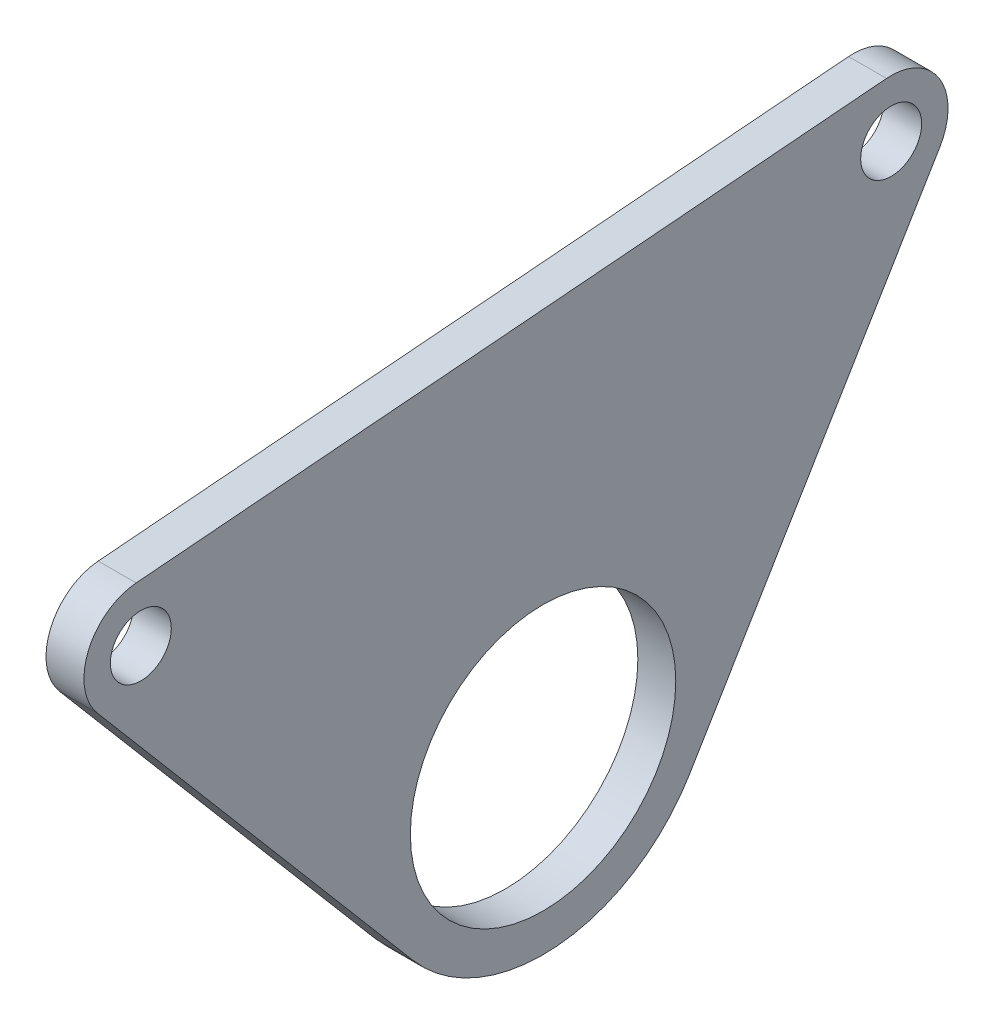
ISO-10303-21;
HEADER;
FILE_DESCRIPTION(('STEP AP214'),'2;1');
FILE_NAME('part.step','',(''),(''),'','','');
FILE_SCHEMA(('AUTOMOTIVE_DESIGN { 1 0 10303 214 1 1 1 1 }'));
ENDSEC;
DATA;
#1=APPLICATION_CONTEXT('core data for automotive mechanical design processes');
#2=APPLICATION_PROTOCOL_DEFINITION('international standard','automotive_design',2000,#1);
#3=PRODUCT_CONTEXT('',#1,'mechanical');
#4=PRODUCT('Part','Part','',(#3));
#5=PRODUCT_RELATED_PRODUCT_CATEGORY('part','',(#4));
#6=PRODUCT_DEFINITION_FORMATION('','',#4);
#7=PRODUCT_DEFINITION_CONTEXT('part definition',#1,'design');
#8=PRODUCT_DEFINITION('design','',#6,#7);
#9=PRODUCT_DEFINITION_SHAPE('','',#8);
#10=(LENGTH_UNIT() NAMED_UNIT(*) SI_UNIT(.MILLI.,.METRE.));
#11=(NAMED_UNIT(*) PLANE_ANGLE_UNIT() SI_UNIT($,.RADIAN.));
#12=(NAMED_UNIT(*) SI_UNIT($,.STERADIAN.) SOLID_ANGLE_UNIT());
#13=UNCERTAINTY_MEASURE_WITH_UNIT(LENGTH_MEASURE(1.E-05),#10,'distance_accuracy_value','');
#14=(GEOMETRIC_REPRESENTATION_CONTEXT(3) GLOBAL_UNCERTAINTY_ASSIGNED_CONTEXT((#13)) GLOBAL_UNIT_ASSIGNED_CONTEXT((#10,
#11,#12)) REPRESENTATION_CONTEXT('',''));
#15=CARTESIAN_POINT('',(0.,0.,0.));
#16=DIRECTION('',(0.,0.,1.));
#17=DIRECTION('',(1.,0.,0.));
#18=AXIS2_PLACEMENT_3D('',#15,#16,#17);
#19=CARTESIAN_POINT('',(-301.625,96.9630533956429,495.757540874985));
#20=DIRECTION('',(-1.,0.,0.));
#21=DIRECTION('',(0.,-1.,0.));
#22=AXIS2_PLACEMENT_3D('',#19,#20,#21);
#23=CYLINDRICAL_SURFACE('',#22,14.2875);
#24=CARTESIAN_POINT('',(-304.8,96.9630533956429,495.757540874985));
#25=DIRECTION('',(1.,0.,0.));
#26=DIRECTION('',(0.,1.,0.));
#27=AXIS2_PLACEMENT_3D('',#24,#25,#26);
#28=CIRCLE('',#27,14.2875);
#29=CARTESIAN_POINT('',(-304.8,87.7184354309227,506.651102961666));
#30=VERTEX_POINT('',#29);
#31=CARTESIAN_POINT('',(-304.8,89.6237613560438,483.499178479972));
#32=VERTEX_POINT('',#31);
#33=EDGE_CURVE('E122',#30,#32,#28,.T.);
#34=ORIENTED_EDGE('',*,*,#33,.T.);
#35=DIRECTION('',(-1.,0.,0.));
#36=VECTOR('',#35,1.);
#37=CARTESIAN_POINT('',(-301.625,89.6237613560438,483.499178479972));
#38=LINE('',#37,#36);
#39=CARTESIAN_POINT('',(-301.625,89.6237613560438,483.499178479972));
#40=VERTEX_POINT('',#39);
#41=EDGE_CURVE('E11',#40,#32,#38,.T.);
#42=ORIENTED_EDGE('',*,*,#41,.F.);
#43=CARTESIAN_POINT('',(-301.625,96.9630533956429,495.757540874985));
#44=DIRECTION('',(1.,0.,0.));
#45=DIRECTION('',(0.,1.,0.));
#46=AXIS2_PLACEMENT_3D('',#43,#44,#45);
#47=CIRCLE('',#46,14.2875);
#48=CARTESIAN_POINT('',(-301.625,87.7184354309227,506.651102961666));
#49=VERTEX_POINT('',#48);
#50=EDGE_CURVE('E69',#49,#40,#47,.T.);
#51=ORIENTED_EDGE('',*,*,#50,.F.);
#52=DIRECTION('',(-1.,0.,0.));
#53=VECTOR('',#52,1.);
#54=CARTESIAN_POINT('',(-301.625,87.7184354309227,506.651102961666));
#55=LINE('',#54,#53);
#56=EDGE_CURVE('E101',#49,#30,#55,.T.);
#57=ORIENTED_EDGE('',*,*,#56,.T.);
#58=EDGE_LOOP('',(#34,#42,#51,#57));
#59=FACE_BOUND('',#58,.T.);
#60=ADVANCED_FACE('F17',(#59),#23,.T.);
#61=CARTESIAN_POINT('',(-301.625,107.140398876517,473.011666839163));
#62=DIRECTION('',(0.,-0.51368623199418,-0.857978120385142));
#63=DIRECTION('',(0.,0.857978120385142,-0.51368623199418));
#64=AXIS2_PLACEMENT_3D('',#61,#62,#63);
#65=PLANE('',#64);
#66=DIRECTION('',(0.,-0.857978120385142,0.513686231994179));
#67=VECTOR('',#66,1.);
#68=CARTESIAN_POINT('',(-304.8,107.140398876517,473.011666839163));
#69=LINE('',#68,#67);
#70=CARTESIAN_POINT('',(-304.8,124.65703639699,462.524155198353));
#71=VERTEX_POINT('',#70);
#72=EDGE_CURVE('E141',#71,#32,#69,.T.);
#73=ORIENTED_EDGE('',*,*,#72,.F.);
#74=DIRECTION('',(-1.,0.,0.));
#75=VECTOR('',#74,1.);
#76=CARTESIAN_POINT('',(-301.625,124.65703639699,462.524155198353));
#77=LINE('',#76,#75);
#78=CARTESIAN_POINT('',(-301.625,124.65703639699,462.524155198353));
#79=VERTEX_POINT('',#78);
#80=EDGE_CURVE('E27',#79,#71,#77,.T.);
#81=ORIENTED_EDGE('',*,*,#80,.F.);
#82=DIRECTION('',(0.,-0.857978120385142,0.513686231994179));
#83=VECTOR('',#82,1.);
#84=CARTESIAN_POINT('',(-301.625,107.140398876517,473.011666839163));
#85=LINE('',#84,#83);
#86=EDGE_CURVE('E105',#79,#40,#85,.T.);
#87=ORIENTED_EDGE('',*,*,#86,.T.);
#88=ORIENTED_EDGE('',*,*,#41,.T.);
#89=EDGE_LOOP('',(#73,#81,#87,#88));
#90=FACE_BOUND('',#89,.T.);
#91=ADVANCED_FACE('F161',(#90),#65,.T.);
#92=CARTESIAN_POINT('',(-301.625,127.103467076862,466.610275996687));
#93=DIRECTION('',(-1.,0.,0.));
#94=DIRECTION('',(0.,-1.,0.));
#95=AXIS2_PLACEMENT_3D('',#92,#93,#94);
#96=CYLINDRICAL_SURFACE('',#95,4.7625);
#97=CARTESIAN_POINT('',(-304.8,127.103467076862,466.610275996687));
#98=DIRECTION('',(1.,0.,0.));
#99=DIRECTION('',(0.,1.,0.));
#100=AXIS2_PLACEMENT_3D('',#97,#98,#99);
#101=CIRCLE('',#100,4.7625);
#102=CARTESIAN_POINT('',(-304.8,131.849920952703,467.000893270388));
#103=VERTEX_POINT('',#102);
#104=EDGE_CURVE('E136',#71,#103,#101,.T.);
#105=ORIENTED_EDGE('',*,*,#104,.T.);
#106=DIRECTION('',(-1.,0.,0.));
#107=VECTOR('',#106,1.);
#108=CARTESIAN_POINT('',(-301.625,131.849920952703,467.000893270388));
#109=LINE('',#108,#107);
#110=CARTESIAN_POINT('',(-301.625,131.849920952703,467.000893270388));
#111=VERTEX_POINT('',#110);
#112=EDGE_CURVE('E57',#111,#103,#109,.T.);
#113=ORIENTED_EDGE('',*,*,#112,.F.);
#114=CARTESIAN_POINT('',(-301.625,127.103467076862,466.610275996687));
#115=DIRECTION('',(1.,0.,0.));
#116=DIRECTION('',(0.,1.,0.));
#117=AXIS2_PLACEMENT_3D('',#114,#115,#116);
#118=CIRCLE('',#117,4.7625);
#119=EDGE_CURVE('E106',#79,#111,#118,.T.);
#120=ORIENTED_EDGE('',*,*,#119,.F.);
#121=ORIENTED_EDGE('',*,*,#80,.T.);
#122=EDGE_LOOP('',(#105,#113,#120,#121));
#123=FACE_BOUND('',#122,.T.);
#124=ADVANCED_FACE('F162',(#123),#96,.T.);
#125=CARTESIAN_POINT('',(-301.625,129.264575279459,498.415848054336));
#126=DIRECTION('',(0.,0.996630735084726,0.0820193750554039));
#127=DIRECTION('',(0.,-0.0820193750554039,0.996630735084726));
#128=AXIS2_PLACEMENT_3D('',#125,#126,#127);
#129=PLANE('',#128);
#130=DIRECTION('',(0.,0.0820193750554039,-0.996630735084726));
#131=VECTOR('',#130,1.);
#132=CARTESIAN_POINT('',(-304.8,129.264575279459,498.415848054336));
#133=LINE('',#132,#131);
#134=CARTESIAN_POINT('',(-304.8,126.679229606215,529.830802838285));
#135=VERTEX_POINT('',#134);
#136=EDGE_CURVE('E145',#135,#103,#133,.T.);
#137=ORIENTED_EDGE('',*,*,#136,.F.);
#138=DIRECTION('',(-1.,0.,0.));
#139=VECTOR('',#138,1.);
#140=CARTESIAN_POINT('',(-301.625,126.679229606215,529.830802838285));
#141=LINE('',#140,#139);
#142=CARTESIAN_POINT('',(-301.625,126.679229606215,529.830802838285));
#143=VERTEX_POINT('',#142);
#144=EDGE_CURVE('E100',#143,#135,#141,.T.);
#145=ORIENTED_EDGE('',*,*,#144,.F.);
#146=DIRECTION('',(0.,0.0820193750554039,-0.996630735084726));
#147=VECTOR('',#146,1.);
#148=CARTESIAN_POINT('',(-301.625,129.264575279459,498.415848054336));
#149=LINE('',#148,#147);
#150=EDGE_CURVE('E85',#143,#111,#149,.T.);
#151=ORIENTED_EDGE('',*,*,#150,.T.);
#152=ORIENTED_EDGE('',*,*,#112,.T.);
#153=EDGE_LOOP('',(#137,#145,#151,#152));
#154=FACE_BOUND('',#153,.T.);
#155=ADVANCED_FACE('F163',(#154),#129,.T.);
#156=CARTESIAN_POINT('',(-301.625,121.932775730374,529.440185564583));
#157=DIRECTION('',(-1.,0.,0.));
#158=DIRECTION('',(0.,-1.,0.));
#159=AXIS2_PLACEMENT_3D('',#156,#157,#158);
#160=CYLINDRICAL_SURFACE('',#159,4.7625);
#161=CARTESIAN_POINT('',(-304.8,121.932775730374,529.440185564583));
#162=DIRECTION('',(1.,0.,0.));
#163=DIRECTION('',(0.,1.,0.));
#164=AXIS2_PLACEMENT_3D('',#161,#162,#163);
#165=CIRCLE('',#164,4.7625);
#166=CARTESIAN_POINT('',(-304.8,118.851236408799,533.071372926809));
#167=VERTEX_POINT('',#166);
#168=EDGE_CURVE('E95',#135,#167,#165,.T.);
#169=ORIENTED_EDGE('',*,*,#168,.T.);
#170=DIRECTION('',(-1.,0.,0.));
#171=VECTOR('',#170,1.);
#172=CARTESIAN_POINT('',(-301.625,118.851236408799,533.071372926809));
#173=LINE('',#172,#171);
#174=CARTESIAN_POINT('',(-301.625,118.851236408799,533.071372926809));
#175=VERTEX_POINT('',#174);
#176=EDGE_CURVE('E92',#175,#167,#173,.T.);
#177=ORIENTED_EDGE('',*,*,#176,.F.);
#178=CARTESIAN_POINT('',(-301.625,121.932775730374,529.440185564583));
#179=DIRECTION('',(1.,0.,0.));
#180=DIRECTION('',(0.,1.,0.));
#181=AXIS2_PLACEMENT_3D('',#178,#179,#180);
#182=CIRCLE('',#181,4.7625);
#183=EDGE_CURVE('E79',#143,#175,#182,.T.);
#184=ORIENTED_EDGE('',*,*,#183,.F.);
#185=ORIENTED_EDGE('',*,*,#144,.T.);
#186=EDGE_LOOP('',(#169,#177,#184,#185));
#187=FACE_BOUND('',#186,.T.);
#188=ADVANCED_FACE('F93',(#187),#160,.T.);
#189=CARTESIAN_POINT('',(-301.625,121.932775730374,529.440185564583));
#190=DIRECTION('',(-1.,0.,0.));
#191=DIRECTION('',(0.,-1.,0.));
#192=AXIS2_PLACEMENT_3D('',#189,#190,#191);
#193=CYLINDRICAL_SURFACE('',#192,2.5527);
#194=CARTESIAN_POINT('',(-301.625,121.932775730374,529.440185564583));
#195=DIRECTION('',(1.,0.,0.));
#196=DIRECTION('',(0.,1.,0.));
#197=AXIS2_PLACEMENT_3D('',#194,#195,#196);
#198=CIRCLE('',#197,2.5527);
#199=CARTESIAN_POINT('',(-301.625,124.485475730374,529.440185564583));
#200=VERTEX_POINT('',#199);
#201=EDGE_CURVE('E89',#200,#200,#198,.T.);
#202=ORIENTED_EDGE('',*,*,#201,.T.);
#203=EDGE_LOOP('',(#202));
#204=FACE_BOUND('',#203,.T.);
#205=CARTESIAN_POINT('',(-304.8,121.932775730374,529.440185564583));
#206=DIRECTION('',(1.,0.,0.));
#207=DIRECTION('',(0.,1.,0.));
#208=AXIS2_PLACEMENT_3D('',#205,#206,#207);
#209=CIRCLE('',#208,2.5527);
#210=CARTESIAN_POINT('',(-304.8,124.485475730374,529.440185564583));
#211=VERTEX_POINT('',#210);
#212=EDGE_CURVE('E126',#211,#211,#209,.T.);
#213=ORIENTED_EDGE('',*,*,#212,.F.);
#214=EDGE_LOOP('',(#213));
#215=FACE_BOUND('',#214,.T.);
#216=ADVANCED_FACE('F170',(#204,#215),#193,.F.);
#217=CARTESIAN_POINT('',(-301.625,103.284835919867,519.86123794423));
#218=DIRECTION('',(0.,-0.647042377233646,0.762454039312425));
#219=DIRECTION('',(0.,-0.762454039312425,-0.647042377233646));
#220=AXIS2_PLACEMENT_3D('',#217,#218,#219);
#221=PLANE('',#220);
#222=DIRECTION('',(0.,0.762454039312425,0.647042377233646));
#223=VECTOR('',#222,1.);
#224=CARTESIAN_POINT('',(-304.8,103.284835919867,519.86123794423));
#225=LINE('',#224,#223);
#226=EDGE_CURVE('E139',#30,#167,#225,.T.);
#227=ORIENTED_EDGE('',*,*,#226,.F.);
#228=ORIENTED_EDGE('',*,*,#56,.F.);
#229=DIRECTION('',(0.,0.762454039312425,0.647042377233646));
#230=VECTOR('',#229,1.);
#231=CARTESIAN_POINT('',(-301.625,103.284835919867,519.86123794423));
#232=LINE('',#231,#230);
#233=EDGE_CURVE('E84',#49,#175,#232,.T.);
#234=ORIENTED_EDGE('',*,*,#233,.T.);
#235=ORIENTED_EDGE('',*,*,#176,.T.);
#236=EDGE_LOOP('',(#227,#228,#234,#235));
#237=FACE_BOUND('',#236,.T.);
#238=ADVANCED_FACE('F103',(#237),#221,.T.);
#239=CARTESIAN_POINT('',(-301.625,96.963053395661,495.757540874975));
#240=DIRECTION('',(-1.,0.,0.));
#241=DIRECTION('',(0.,-1.,0.));
#242=AXIS2_PLACEMENT_3D('',#239,#240,#241);
#243=CYLINDRICAL_SURFACE('',#242,11.1125);
#244=CARTESIAN_POINT('',(-301.625,96.963053395661,495.757540874975));
#245=DIRECTION('',(1.,0.,0.));
#246=DIRECTION('',(0.,1.,0.));
#247=AXIS2_PLACEMENT_3D('',#244,#245,#246);
#248=CIRCLE('',#247,11.1125);
#249=CARTESIAN_POINT('',(-301.625,108.075553395661,495.757540874975));
#250=VERTEX_POINT('',#249);
#251=EDGE_CURVE('E149',#250,#250,#248,.T.);
#252=ORIENTED_EDGE('',*,*,#251,.T.);
#253=EDGE_LOOP('',(#252));
#254=FACE_BOUND('',#253,.T.);
#255=CARTESIAN_POINT('',(-304.8,96.963053395661,495.757540874975));
#256=DIRECTION('',(1.,0.,0.));
#257=DIRECTION('',(0.,1.,0.));
#258=AXIS2_PLACEMENT_3D('',#255,#256,#257);
#259=CIRCLE('',#258,11.1125);
#260=CARTESIAN_POINT('',(-304.8,108.075553395661,495.757540874975));
#261=VERTEX_POINT('',#260);
#262=EDGE_CURVE('E118',#261,#261,#259,.T.);
#263=ORIENTED_EDGE('',*,*,#262,.F.);
#264=EDGE_LOOP('',(#263));
#265=FACE_BOUND('',#264,.T.);
#266=ADVANCED_FACE('F19',(#254,#265),#243,.F.);
#267=CARTESIAN_POINT('',(-301.625,127.103467076862,466.610275996687));
#268=DIRECTION('',(-1.,0.,0.));
#269=DIRECTION('',(0.,-1.,0.));
#270=AXIS2_PLACEMENT_3D('',#267,#268,#269);
#271=CYLINDRICAL_SURFACE('',#270,2.5527);
#272=CARTESIAN_POINT('',(-301.625,127.103467076862,466.610275996687));
#273=DIRECTION('',(1.,0.,0.));
#274=DIRECTION('',(0.,1.,0.));
#275=AXIS2_PLACEMENT_3D('',#272,#273,#274);
#276=CIRCLE('',#275,2.5527);
#277=CARTESIAN_POINT('',(-301.625,129.656167076862,466.610275996687));
#278=VERTEX_POINT('',#277);
#279=EDGE_CURVE('E88',#278,#278,#276,.T.);
#280=ORIENTED_EDGE('',*,*,#279,.T.);
#281=EDGE_LOOP('',(#280));
#282=FACE_BOUND('',#281,.T.);
#283=CARTESIAN_POINT('',(-304.8,127.103467076862,466.610275996687));
#284=DIRECTION('',(1.,0.,0.));
#285=DIRECTION('',(0.,1.,0.));
#286=AXIS2_PLACEMENT_3D('',#283,#284,#285);
#287=CIRCLE('',#286,2.5527);
#288=CARTESIAN_POINT('',(-304.8,129.656167076862,466.610275996687));
#289=VERTEX_POINT('',#288);
#290=EDGE_CURVE('E132',#289,#289,#287,.T.);
#291=ORIENTED_EDGE('',*,*,#290,.F.);
#292=EDGE_LOOP('',(#291));
#293=FACE_BOUND('',#292,.T.);
#294=ADVANCED_FACE('F182',(#282,#293),#271,.F.);
#295=CARTESIAN_POINT('',(-301.625,180.610602461199,432.805098340539));
#296=DIRECTION('',(1.,0.,0.));
#297=DIRECTION('',(0.,1.,0.));
#298=AXIS2_PLACEMENT_3D('',#295,#296,#297);
#299=PLANE('',#298);
#300=ORIENTED_EDGE('',*,*,#251,.F.);
#301=EDGE_LOOP('',(#300));
#302=FACE_BOUND('',#301,.T.);
#303=ORIENTED_EDGE('',*,*,#50,.T.);
#304=ORIENTED_EDGE('',*,*,#86,.F.);
#305=ORIENTED_EDGE('',*,*,#119,.T.);
#306=ORIENTED_EDGE('',*,*,#150,.F.);
#307=ORIENTED_EDGE('',*,*,#183,.T.);
#308=ORIENTED_EDGE('',*,*,#233,.F.);
#309=EDGE_LOOP('',(#303,#304,#305,#306,#307,#308));
#310=FACE_BOUND('',#309,.T.);
#311=ORIENTED_EDGE('',*,*,#201,.F.);
#312=EDGE_LOOP('',(#311));
#313=FACE_BOUND('',#312,.T.);
#314=ORIENTED_EDGE('',*,*,#279,.F.);
#315=EDGE_LOOP('',(#314));
#316=FACE_BOUND('',#315,.T.);
#317=ADVANCED_FACE('F81',(#302,#310,#313,#316),#299,.T.);
#318=CARTESIAN_POINT('',(-304.8,180.610602461199,432.805098340539));
#319=DIRECTION('',(1.,0.,0.));
#320=DIRECTION('',(0.,1.,0.));
#321=AXIS2_PLACEMENT_3D('',#318,#319,#320);
#322=PLANE('',#321);
#323=ORIENTED_EDGE('',*,*,#262,.T.);
#324=EDGE_LOOP('',(#323));
#325=FACE_BOUND('',#324,.T.);
#326=ORIENTED_EDGE('',*,*,#33,.F.);
#327=ORIENTED_EDGE('',*,*,#226,.T.);
#328=ORIENTED_EDGE('',*,*,#168,.F.);
#329=ORIENTED_EDGE('',*,*,#136,.T.);
#330=ORIENTED_EDGE('',*,*,#104,.F.);
#331=ORIENTED_EDGE('',*,*,#72,.T.);
#332=EDGE_LOOP('',(#326,#327,#328,#329,#330,#331));
#333=FACE_BOUND('',#332,.T.);
#334=ORIENTED_EDGE('',*,*,#212,.T.);
#335=EDGE_LOOP('',(#334));
#336=FACE_BOUND('',#335,.T.);
#337=ORIENTED_EDGE('',*,*,#290,.T.);
#338=EDGE_LOOP('',(#337));
#339=FACE_BOUND('',#338,.T.);
#340=ADVANCED_FACE('F159',(#325,#333,#336,#339),#322,.F.);
#341=CLOSED_SHELL('',(#60,#91,#124,#155,#188,#216,#238,#266,#294,#317,#340));
#342=MANIFOLD_SOLID_BREP('B1',#341);
#343=ADVANCED_BREP_SHAPE_REPRESENTATION('',(#18,#342),#14);
#344=SHAPE_DEFINITION_REPRESENTATION(#9,#343);
ENDSEC;
END-ISO-10303-21;
